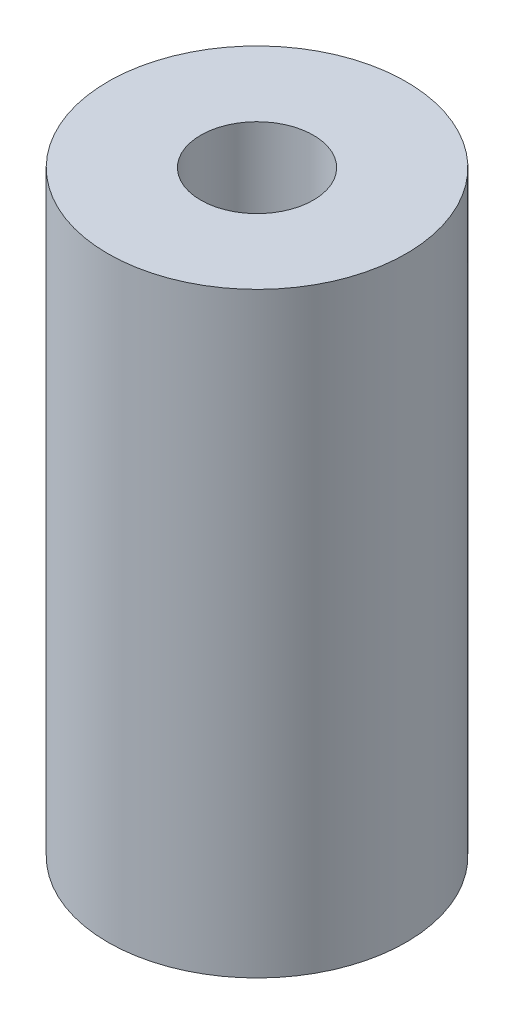
ISO-10303-21;
HEADER;
FILE_DESCRIPTION(('STEP AP214'),'2;1');
FILE_NAME('part.step','',(''),(''),'','','');
FILE_SCHEMA(('AUTOMOTIVE_DESIGN { 1 0 10303 214 1 1 1 1 }'));
ENDSEC;
DATA;
#1=APPLICATION_CONTEXT('core data for automotive mechanical design processes');
#2=APPLICATION_PROTOCOL_DEFINITION('international standard','automotive_design',2000,#1);
#3=PRODUCT_CONTEXT('',#1,'mechanical');
#4=PRODUCT('Part','Part','',(#3));
#5=PRODUCT_RELATED_PRODUCT_CATEGORY('part','',(#4));
#6=PRODUCT_DEFINITION_FORMATION('','',#4);
#7=PRODUCT_DEFINITION_CONTEXT('part definition',#1,'design');
#8=PRODUCT_DEFINITION('design','',#6,#7);
#9=PRODUCT_DEFINITION_SHAPE('','',#8);
#10=(LENGTH_UNIT() NAMED_UNIT(*) SI_UNIT(.MILLI.,.METRE.));
#11=(NAMED_UNIT(*) PLANE_ANGLE_UNIT() SI_UNIT($,.RADIAN.));
#12=(NAMED_UNIT(*) SI_UNIT($,.STERADIAN.) SOLID_ANGLE_UNIT());
#13=UNCERTAINTY_MEASURE_WITH_UNIT(LENGTH_MEASURE(1.E-05),#10,'distance_accuracy_value','');
#14=(GEOMETRIC_REPRESENTATION_CONTEXT(3) GLOBAL_UNCERTAINTY_ASSIGNED_CONTEXT((#13)) GLOBAL_UNIT_ASSIGNED_CONTEXT((#10,
#11,#12)) REPRESENTATION_CONTEXT('',''));
#15=CARTESIAN_POINT('',(0.,0.,0.));
#16=DIRECTION('',(0.,0.,1.));
#17=DIRECTION('',(1.,0.,0.));
#18=AXIS2_PLACEMENT_3D('',#15,#16,#17);
#19=CARTESIAN_POINT('',(0.,18.,0.));
#20=DIRECTION('',(0.,-1.,0.));
#21=DIRECTION('',(0.,0.,-1.));
#22=AXIS2_PLACEMENT_3D('',#19,#20,#21);
#23=CYLINDRICAL_SURFACE('',#22,4.5);
#24=CARTESIAN_POINT('',(0.,18.,0.));
#25=DIRECTION('',(0.,1.,0.));
#26=DIRECTION('',(0.,0.,1.));
#27=AXIS2_PLACEMENT_3D('',#24,#25,#26);
#28=CIRCLE('',#27,4.5);
#29=CARTESIAN_POINT('',(0.,18.,4.5));
#30=VERTEX_POINT('',#29);
#31=EDGE_CURVE('E10',#30,#30,#28,.T.);
#32=ORIENTED_EDGE('',*,*,#31,.F.);
#33=EDGE_LOOP('',(#32));
#34=FACE_BOUND('',#33,.T.);
#35=CARTESIAN_POINT('',(0.,0.,0.));
#36=DIRECTION('',(0.,1.,0.));
#37=DIRECTION('',(0.,0.,1.));
#38=AXIS2_PLACEMENT_3D('',#35,#36,#37);
#39=CIRCLE('',#38,4.5);
#40=CARTESIAN_POINT('',(0.,0.,4.5));
#41=VERTEX_POINT('',#40);
#42=EDGE_CURVE('E42',#41,#41,#39,.T.);
#43=ORIENTED_EDGE('',*,*,#42,.T.);
#44=EDGE_LOOP('',(#43));
#45=FACE_BOUND('',#44,.T.);
#46=ADVANCED_FACE('F39',(#34,#45),#23,.T.);
#47=CARTESIAN_POINT('',(0.,18.,0.));
#48=DIRECTION('',(0.,1.,0.));
#49=DIRECTION('',(0.,0.,1.));
#50=AXIS2_PLACEMENT_3D('',#47,#48,#49);
#51=PLANE('',#50);
#52=CARTESIAN_POINT('',(0.,18.,0.));
#53=DIRECTION('',(0.,1.,0.));
#54=DIRECTION('',(0.,0.,1.));
#55=AXIS2_PLACEMENT_3D('',#52,#53,#54);
#56=CIRCLE('',#55,1.7);
#57=CARTESIAN_POINT('',(0.,18.,1.7));
#58=VERTEX_POINT('',#57);
#59=EDGE_CURVE('E51',#58,#58,#56,.T.);
#60=ORIENTED_EDGE('',*,*,#59,.F.);
#61=EDGE_LOOP('',(#60));
#62=FACE_BOUND('',#61,.T.);
#63=ORIENTED_EDGE('',*,*,#31,.T.);
#64=EDGE_LOOP('',(#63));
#65=FACE_BOUND('',#64,.T.);
#66=ADVANCED_FACE('F76',(#62,#65),#51,.T.);
#67=CARTESIAN_POINT('',(0.,0.,0.));
#68=DIRECTION('',(0.,1.,0.));
#69=DIRECTION('',(0.,0.,1.));
#70=AXIS2_PLACEMENT_3D('',#67,#68,#69);
#71=PLANE('',#70);
#72=CARTESIAN_POINT('',(0.,0.,0.));
#73=DIRECTION('',(0.,-1.,0.));
#74=DIRECTION('',(0.,0.,-1.));
#75=AXIS2_PLACEMENT_3D('',#72,#73,#74);
#76=CIRCLE('',#75,2.5);
#77=CARTESIAN_POINT('',(0.,0.,-2.5));
#78=VERTEX_POINT('',#77);
#79=EDGE_CURVE('E57',#78,#78,#76,.T.);
#80=ORIENTED_EDGE('',*,*,#79,.F.);
#81=EDGE_LOOP('',(#80));
#82=FACE_BOUND('',#81,.T.);
#83=ORIENTED_EDGE('',*,*,#42,.F.);
#84=EDGE_LOOP('',(#83));
#85=FACE_BOUND('',#84,.T.);
#86=ADVANCED_FACE('F72',(#82,#85),#71,.F.);
#87=CARTESIAN_POINT('',(0.,10.,0.));
#88=DIRECTION('',(0.,1.,0.));
#89=DIRECTION('',(0.,0.,1.));
#90=AXIS2_PLACEMENT_3D('',#87,#88,#89);
#91=CYLINDRICAL_SURFACE('',#90,1.7);
#92=CARTESIAN_POINT('',(0.,10.,0.));
#93=DIRECTION('',(0.,1.,0.));
#94=DIRECTION('',(0.,0.,1.));
#95=AXIS2_PLACEMENT_3D('',#92,#93,#94);
#96=CIRCLE('',#95,1.7);
#97=CARTESIAN_POINT('',(0.,10.,1.7));
#98=VERTEX_POINT('',#97);
#99=EDGE_CURVE('E49',#98,#98,#96,.T.);
#100=ORIENTED_EDGE('',*,*,#99,.F.);
#101=EDGE_LOOP('',(#100));
#102=FACE_BOUND('',#101,.T.);
#103=ORIENTED_EDGE('',*,*,#59,.T.);
#104=EDGE_LOOP('',(#103));
#105=FACE_BOUND('',#104,.T.);
#106=ADVANCED_FACE('F75',(#102,#105),#91,.F.);
#107=CARTESIAN_POINT('',(0.,10.,0.));
#108=DIRECTION('',(0.,1.,0.));
#109=DIRECTION('',(0.,0.,1.));
#110=AXIS2_PLACEMENT_3D('',#107,#108,#109);
#111=PLANE('',#110);
#112=ORIENTED_EDGE('',*,*,#99,.T.);
#113=EDGE_LOOP('',(#112));
#114=FACE_BOUND('',#113,.T.);
#115=ADVANCED_FACE('F68',(#114),#111,.T.);
#116=CARTESIAN_POINT('',(0.,8.,0.));
#117=DIRECTION('',(0.,-1.,0.));
#118=DIRECTION('',(0.,0.,-1.));
#119=AXIS2_PLACEMENT_3D('',#116,#117,#118);
#120=CYLINDRICAL_SURFACE('',#119,2.5);
#121=CARTESIAN_POINT('',(0.,8.,0.));
#122=DIRECTION('',(0.,-1.,0.));
#123=DIRECTION('',(0.,0.,-1.));
#124=AXIS2_PLACEMENT_3D('',#121,#122,#123);
#125=CIRCLE('',#124,2.5);
#126=CARTESIAN_POINT('',(0.,8.,-2.5));
#127=VERTEX_POINT('',#126);
#128=EDGE_CURVE('E54',#127,#127,#125,.T.);
#129=ORIENTED_EDGE('',*,*,#128,.F.);
#130=EDGE_LOOP('',(#129));
#131=FACE_BOUND('',#130,.T.);
#132=ORIENTED_EDGE('',*,*,#79,.T.);
#133=EDGE_LOOP('',(#132));
#134=FACE_BOUND('',#133,.T.);
#135=ADVANCED_FACE('F65',(#131,#134),#120,.F.);
#136=CARTESIAN_POINT('',(0.,8.,0.));
#137=DIRECTION('',(0.,-1.,0.));
#138=DIRECTION('',(0.,0.,-1.));
#139=AXIS2_PLACEMENT_3D('',#136,#137,#138);
#140=PLANE('',#139);
#141=ORIENTED_EDGE('',*,*,#128,.T.);
#142=EDGE_LOOP('',(#141));
#143=FACE_BOUND('',#142,.T.);
#144=ADVANCED_FACE('F63',(#143),#140,.T.);
#145=CLOSED_SHELL('',(#46,#66,#86,#106,#115,#135,#144));
#146=MANIFOLD_SOLID_BREP('B2',#145);
#147=ADVANCED_BREP_SHAPE_REPRESENTATION('',(#18,#146),#14);
#148=SHAPE_DEFINITION_REPRESENTATION(#9,#147);
ENDSEC;
END-ISO-10303-21;
